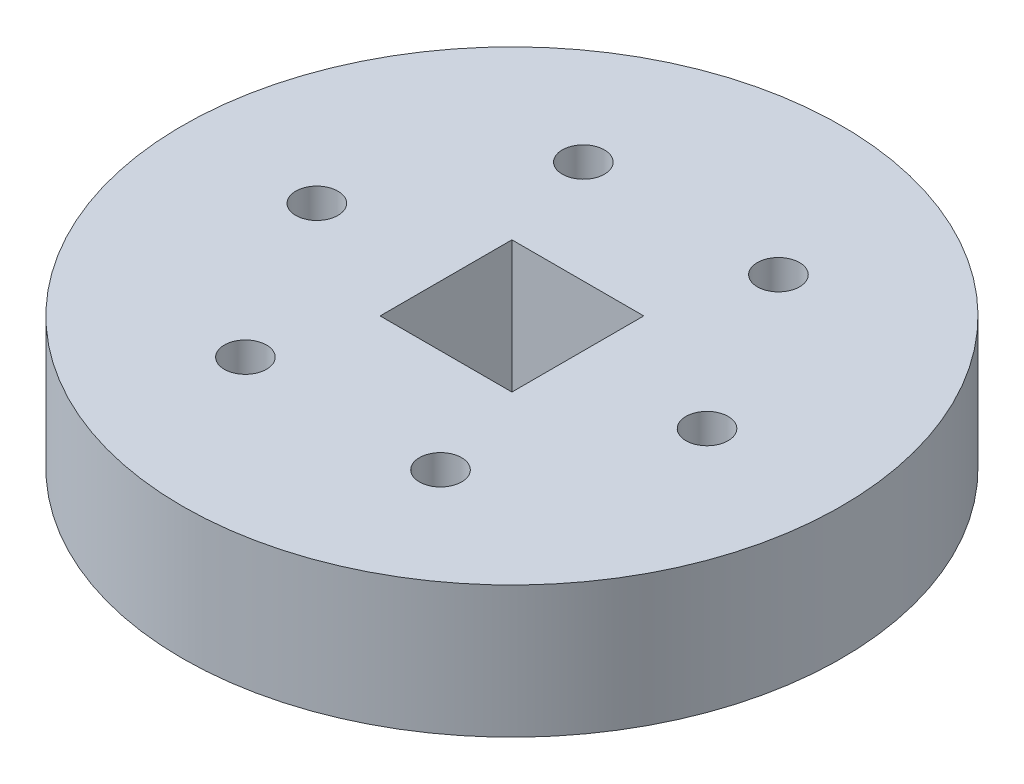
ISO-10303-21;
HEADER;
FILE_DESCRIPTION(('STEP AP214'),'2;1');
FILE_NAME('part.step','',(''),(''),'','','');
FILE_SCHEMA(('AUTOMOTIVE_DESIGN { 1 0 10303 214 1 1 1 1 }'));
ENDSEC;
DATA;
#1=APPLICATION_CONTEXT('core data for automotive mechanical design processes');
#2=APPLICATION_PROTOCOL_DEFINITION('international standard','automotive_design',2000,#1);
#3=PRODUCT_CONTEXT('',#1,'mechanical');
#4=PRODUCT('Part','Part','',(#3));
#5=PRODUCT_RELATED_PRODUCT_CATEGORY('part','',(#4));
#6=PRODUCT_DEFINITION_FORMATION('','',#4);
#7=PRODUCT_DEFINITION_CONTEXT('part definition',#1,'design');
#8=PRODUCT_DEFINITION('design','',#6,#7);
#9=PRODUCT_DEFINITION_SHAPE('','',#8);
#10=(LENGTH_UNIT() NAMED_UNIT(*) SI_UNIT(.MILLI.,.METRE.));
#11=(NAMED_UNIT(*) PLANE_ANGLE_UNIT() SI_UNIT($,.RADIAN.));
#12=(NAMED_UNIT(*) SI_UNIT($,.STERADIAN.) SOLID_ANGLE_UNIT());
#13=UNCERTAINTY_MEASURE_WITH_UNIT(LENGTH_MEASURE(1.E-05),#10,'distance_accuracy_value','');
#14=(GEOMETRIC_REPRESENTATION_CONTEXT(3) GLOBAL_UNCERTAINTY_ASSIGNED_CONTEXT((#13)) GLOBAL_UNIT_ASSIGNED_CONTEXT((#10,
#11,#12)) REPRESENTATION_CONTEXT('',''));
#15=CARTESIAN_POINT('',(0.,0.,0.));
#16=DIRECTION('',(0.,0.,1.));
#17=DIRECTION('',(1.,0.,0.));
#18=AXIS2_PLACEMENT_3D('',#15,#16,#17);
#19=CARTESIAN_POINT('',(0.,6.35,0.));
#20=DIRECTION('',(0.,1.,0.));
#21=DIRECTION('',(0.,0.,1.));
#22=AXIS2_PLACEMENT_3D('',#19,#20,#21);
#23=PLANE('',#22);
#24=CARTESIAN_POINT('',(-4.699,6.35,-8.13890674476615));
#25=DIRECTION('',(0.,1.,0.));
#26=DIRECTION('',(0.,0.,1.));
#27=AXIS2_PLACEMENT_3D('',#24,#25,#26);
#28=CIRCLE('',#27,1.016);
#29=CARTESIAN_POINT('',(-4.699,6.35,-7.12290674476615));
#30=VERTEX_POINT('',#29);
#31=EDGE_CURVE('E226',#30,#30,#28,.T.);
#32=ORIENTED_EDGE('',*,*,#31,.F.);
#33=EDGE_LOOP('',(#32));
#34=FACE_BOUND('',#33,.T.);
#35=CARTESIAN_POINT('',(-4.699,6.35,8.13890674476616));
#36=DIRECTION('',(0.,1.,0.));
#37=DIRECTION('',(0.,0.,1.));
#38=AXIS2_PLACEMENT_3D('',#35,#36,#37);
#39=CIRCLE('',#38,1.016);
#40=CARTESIAN_POINT('',(-4.699,6.35,9.15490674476615));
#41=VERTEX_POINT('',#40);
#42=EDGE_CURVE('E238',#41,#41,#39,.T.);
#43=ORIENTED_EDGE('',*,*,#42,.F.);
#44=EDGE_LOOP('',(#43));
#45=FACE_BOUND('',#44,.T.);
#46=CARTESIAN_POINT('',(9.398,6.35,0.));
#47=DIRECTION('',(0.,1.,0.));
#48=DIRECTION('',(0.,0.,1.));
#49=AXIS2_PLACEMENT_3D('',#46,#47,#48);
#50=CIRCLE('',#49,1.016);
#51=CARTESIAN_POINT('',(9.398,6.35,1.016));
#52=VERTEX_POINT('',#51);
#53=EDGE_CURVE('E102',#52,#52,#50,.T.);
#54=ORIENTED_EDGE('',*,*,#53,.F.);
#55=EDGE_LOOP('',(#54));
#56=FACE_BOUND('',#55,.T.);
#57=CARTESIAN_POINT('',(0.,6.35,0.));
#58=DIRECTION('',(0.,1.,0.));
#59=DIRECTION('',(0.,0.,1.));
#60=AXIS2_PLACEMENT_3D('',#57,#58,#59);
#61=CIRCLE('',#60,15.875);
#62=CARTESIAN_POINT('',(0.,6.35,15.875));
#63=VERTEX_POINT('',#62);
#64=EDGE_CURVE('E11',#63,#63,#61,.T.);
#65=ORIENTED_EDGE('',*,*,#64,.T.);
#66=EDGE_LOOP('',(#65));
#67=FACE_BOUND('',#66,.T.);
#68=DIRECTION('',(-1.,0.,0.));
#69=VECTOR('',#68,1.);
#70=CARTESIAN_POINT('',(-3.175,6.35,-3.175));
#71=LINE('',#70,#69);
#72=CARTESIAN_POINT('',(3.175,6.35,-3.175));
#73=VERTEX_POINT('',#72);
#74=CARTESIAN_POINT('',(-3.175,6.35,-3.175));
#75=VERTEX_POINT('',#74);
#76=EDGE_CURVE('E82',#73,#75,#71,.T.);
#77=ORIENTED_EDGE('',*,*,#76,.F.);
#78=DIRECTION('',(0.,0.,-1.));
#79=VECTOR('',#78,1.);
#80=CARTESIAN_POINT('',(3.175,6.35,-3.175));
#81=LINE('',#80,#79);
#82=CARTESIAN_POINT('',(3.175,6.35,3.175));
#83=VERTEX_POINT('',#82);
#84=EDGE_CURVE('E74',#83,#73,#81,.T.);
#85=ORIENTED_EDGE('',*,*,#84,.F.);
#86=DIRECTION('',(1.,0.,0.));
#87=VECTOR('',#86,1.);
#88=CARTESIAN_POINT('',(-3.175,6.35,3.175));
#89=LINE('',#88,#87);
#90=CARTESIAN_POINT('',(-3.175,6.35,3.175));
#91=VERTEX_POINT('',#90);
#92=EDGE_CURVE('E96',#91,#83,#89,.T.);
#93=ORIENTED_EDGE('',*,*,#92,.F.);
#94=DIRECTION('',(0.,0.,1.));
#95=VECTOR('',#94,1.);
#96=CARTESIAN_POINT('',(-3.175,6.35,-3.175));
#97=LINE('',#96,#95);
#98=EDGE_CURVE('E94',#75,#91,#97,.T.);
#99=ORIENTED_EDGE('',*,*,#98,.F.);
#100=EDGE_LOOP('',(#77,#85,#93,#99));
#101=FACE_BOUND('',#100,.T.);
#102=CARTESIAN_POINT('',(4.699,6.35,8.13890674476615));
#103=DIRECTION('',(0.,1.,0.));
#104=DIRECTION('',(0.,0.,1.));
#105=AXIS2_PLACEMENT_3D('',#102,#103,#104);
#106=CIRCLE('',#105,1.016);
#107=CARTESIAN_POINT('',(4.699,6.35,9.15490674476615));
#108=VERTEX_POINT('',#107);
#109=EDGE_CURVE('E244',#108,#108,#106,.T.);
#110=ORIENTED_EDGE('',*,*,#109,.F.);
#111=EDGE_LOOP('',(#110));
#112=FACE_BOUND('',#111,.T.);
#113=CARTESIAN_POINT('',(-9.398,6.35,0.));
#114=DIRECTION('',(0.,1.,0.));
#115=DIRECTION('',(0.,0.,1.));
#116=AXIS2_PLACEMENT_3D('',#113,#114,#115);
#117=CIRCLE('',#116,1.016);
#118=CARTESIAN_POINT('',(-9.398,6.35,1.016));
#119=VERTEX_POINT('',#118);
#120=EDGE_CURVE('E232',#119,#119,#117,.T.);
#121=ORIENTED_EDGE('',*,*,#120,.F.);
#122=EDGE_LOOP('',(#121));
#123=FACE_BOUND('',#122,.T.);
#124=CARTESIAN_POINT('',(4.69899999999999,6.35,-8.13890674476616));
#125=DIRECTION('',(0.,1.,0.));
#126=DIRECTION('',(0.,0.,1.));
#127=AXIS2_PLACEMENT_3D('',#124,#125,#126);
#128=CIRCLE('',#127,1.016);
#129=CARTESIAN_POINT('',(4.69899999999999,6.35,-7.12290674476616));
#130=VERTEX_POINT('',#129);
#131=EDGE_CURVE('E217',#130,#130,#128,.T.);
#132=ORIENTED_EDGE('',*,*,#131,.F.);
#133=EDGE_LOOP('',(#132));
#134=FACE_BOUND('',#133,.T.);
#135=ADVANCED_FACE('F33',(#34,#45,#56,#67,#101,#112,#123,#134),#23,.T.);
#136=CARTESIAN_POINT('',(0.,0.,0.));
#137=DIRECTION('',(0.,1.,0.));
#138=DIRECTION('',(0.,0.,1.));
#139=AXIS2_PLACEMENT_3D('',#136,#137,#138);
#140=PLANE('',#139);
#141=CARTESIAN_POINT('',(-4.699,0.,-8.13890674476615));
#142=DIRECTION('',(0.,1.,0.));
#143=DIRECTION('',(0.,0.,1.));
#144=AXIS2_PLACEMENT_3D('',#141,#142,#143);
#145=CIRCLE('',#144,1.016);
#146=CARTESIAN_POINT('',(-4.699,0.,-7.12290674476615));
#147=VERTEX_POINT('',#146);
#148=EDGE_CURVE('E223',#147,#147,#145,.T.);
#149=ORIENTED_EDGE('',*,*,#148,.T.);
#150=EDGE_LOOP('',(#149));
#151=FACE_BOUND('',#150,.T.);
#152=CARTESIAN_POINT('',(-4.699,0.,8.13890674476616));
#153=DIRECTION('',(0.,1.,0.));
#154=DIRECTION('',(0.,0.,1.));
#155=AXIS2_PLACEMENT_3D('',#152,#153,#154);
#156=CIRCLE('',#155,1.016);
#157=CARTESIAN_POINT('',(-4.699,0.,9.15490674476615));
#158=VERTEX_POINT('',#157);
#159=EDGE_CURVE('E235',#158,#158,#156,.T.);
#160=ORIENTED_EDGE('',*,*,#159,.T.);
#161=EDGE_LOOP('',(#160));
#162=FACE_BOUND('',#161,.T.);
#163=CARTESIAN_POINT('',(9.398,0.,0.));
#164=DIRECTION('',(0.,1.,0.));
#165=DIRECTION('',(0.,0.,1.));
#166=AXIS2_PLACEMENT_3D('',#163,#164,#165);
#167=CIRCLE('',#166,1.016);
#168=CARTESIAN_POINT('',(9.398,0.,1.016));
#169=VERTEX_POINT('',#168);
#170=EDGE_CURVE('E247',#169,#169,#167,.T.);
#171=ORIENTED_EDGE('',*,*,#170,.T.);
#172=EDGE_LOOP('',(#171));
#173=FACE_BOUND('',#172,.T.);
#174=CARTESIAN_POINT('',(0.,0.,0.));
#175=DIRECTION('',(0.,1.,0.));
#176=DIRECTION('',(0.,0.,1.));
#177=AXIS2_PLACEMENT_3D('',#174,#175,#176);
#178=CIRCLE('',#177,15.875);
#179=CARTESIAN_POINT('',(0.,0.,15.875));
#180=VERTEX_POINT('',#179);
#181=EDGE_CURVE('E37',#180,#180,#178,.T.);
#182=ORIENTED_EDGE('',*,*,#181,.F.);
#183=EDGE_LOOP('',(#182));
#184=FACE_BOUND('',#183,.T.);
#185=DIRECTION('',(0.,0.,-1.));
#186=VECTOR('',#185,1.);
#187=CARTESIAN_POINT('',(3.175,0.,-3.175));
#188=LINE('',#187,#186);
#189=CARTESIAN_POINT('',(3.175,0.,3.175));
#190=VERTEX_POINT('',#189);
#191=CARTESIAN_POINT('',(3.175,0.,-3.175));
#192=VERTEX_POINT('',#191);
#193=EDGE_CURVE('E56',#190,#192,#188,.T.);
#194=ORIENTED_EDGE('',*,*,#193,.T.);
#195=DIRECTION('',(-1.,0.,0.));
#196=VECTOR('',#195,1.);
#197=CARTESIAN_POINT('',(-3.175,0.,-3.175));
#198=LINE('',#197,#196);
#199=CARTESIAN_POINT('',(-3.175,0.,-3.175));
#200=VERTEX_POINT('',#199);
#201=EDGE_CURVE('E89',#192,#200,#198,.T.);
#202=ORIENTED_EDGE('',*,*,#201,.T.);
#203=DIRECTION('',(0.,0.,1.));
#204=VECTOR('',#203,1.);
#205=CARTESIAN_POINT('',(-3.175,0.,-3.175));
#206=LINE('',#205,#204);
#207=CARTESIAN_POINT('',(-3.175,0.,3.175));
#208=VERTEX_POINT('',#207);
#209=EDGE_CURVE('E104',#200,#208,#206,.T.);
#210=ORIENTED_EDGE('',*,*,#209,.T.);
#211=DIRECTION('',(1.,0.,0.));
#212=VECTOR('',#211,1.);
#213=CARTESIAN_POINT('',(-3.175,0.,3.175));
#214=LINE('',#213,#212);
#215=EDGE_CURVE('E83',#208,#190,#214,.T.);
#216=ORIENTED_EDGE('',*,*,#215,.T.);
#217=EDGE_LOOP('',(#194,#202,#210,#216));
#218=FACE_BOUND('',#217,.T.);
#219=CARTESIAN_POINT('',(4.699,0.,8.13890674476615));
#220=DIRECTION('',(0.,1.,0.));
#221=DIRECTION('',(0.,0.,1.));
#222=AXIS2_PLACEMENT_3D('',#219,#220,#221);
#223=CIRCLE('',#222,1.016);
#224=CARTESIAN_POINT('',(4.699,0.,9.15490674476615));
#225=VERTEX_POINT('',#224);
#226=EDGE_CURVE('E241',#225,#225,#223,.T.);
#227=ORIENTED_EDGE('',*,*,#226,.T.);
#228=EDGE_LOOP('',(#227));
#229=FACE_BOUND('',#228,.T.);
#230=CARTESIAN_POINT('',(-9.398,0.,0.));
#231=DIRECTION('',(0.,1.,0.));
#232=DIRECTION('',(0.,0.,1.));
#233=AXIS2_PLACEMENT_3D('',#230,#231,#232);
#234=CIRCLE('',#233,1.016);
#235=CARTESIAN_POINT('',(-9.398,0.,1.016));
#236=VERTEX_POINT('',#235);
#237=EDGE_CURVE('E229',#236,#236,#234,.T.);
#238=ORIENTED_EDGE('',*,*,#237,.T.);
#239=EDGE_LOOP('',(#238));
#240=FACE_BOUND('',#239,.T.);
#241=CARTESIAN_POINT('',(4.69899999999999,0.,-8.13890674476616));
#242=DIRECTION('',(0.,1.,0.));
#243=DIRECTION('',(0.,0.,1.));
#244=AXIS2_PLACEMENT_3D('',#241,#242,#243);
#245=CIRCLE('',#244,1.016);
#246=CARTESIAN_POINT('',(4.69899999999999,0.,-7.12290674476616));
#247=VERTEX_POINT('',#246);
#248=EDGE_CURVE('E220',#247,#247,#245,.T.);
#249=ORIENTED_EDGE('',*,*,#248,.T.);
#250=EDGE_LOOP('',(#249));
#251=FACE_BOUND('',#250,.T.);
#252=ADVANCED_FACE('F115',(#151,#162,#173,#184,#218,#229,#240,#251),#140,.F.);
#253=CARTESIAN_POINT('',(0.,6.35,0.));
#254=DIRECTION('',(0.,-1.,0.));
#255=DIRECTION('',(0.,0.,-1.));
#256=AXIS2_PLACEMENT_3D('',#253,#254,#255);
#257=CYLINDRICAL_SURFACE('',#256,15.875);
#258=ORIENTED_EDGE('',*,*,#64,.F.);
#259=EDGE_LOOP('',(#258));
#260=FACE_BOUND('',#259,.T.);
#261=ORIENTED_EDGE('',*,*,#181,.T.);
#262=EDGE_LOOP('',(#261));
#263=FACE_BOUND('',#262,.T.);
#264=ADVANCED_FACE('F35',(#260,#263),#257,.T.);
#265=CARTESIAN_POINT('',(3.175,6.35,-3.175));
#266=DIRECTION('',(-1.,0.,0.));
#267=DIRECTION('',(0.,0.,1.));
#268=AXIS2_PLACEMENT_3D('',#265,#266,#267);
#269=PLANE('',#268);
#270=ORIENTED_EDGE('',*,*,#193,.F.);
#271=DIRECTION('',(0.,-1.,0.));
#272=VECTOR('',#271,1.);
#273=CARTESIAN_POINT('',(3.175,6.35,3.175));
#274=LINE('',#273,#272);
#275=EDGE_CURVE('E78',#83,#190,#274,.T.);
#276=ORIENTED_EDGE('',*,*,#275,.F.);
#277=ORIENTED_EDGE('',*,*,#84,.T.);
#278=DIRECTION('',(0.,-1.,0.));
#279=VECTOR('',#278,1.);
#280=CARTESIAN_POINT('',(3.175,6.35,-3.175));
#281=LINE('',#280,#279);
#282=EDGE_CURVE('E77',#73,#192,#281,.T.);
#283=ORIENTED_EDGE('',*,*,#282,.T.);
#284=EDGE_LOOP('',(#270,#276,#277,#283));
#285=FACE_BOUND('',#284,.T.);
#286=ADVANCED_FACE('F76',(#285),#269,.T.);
#287=CARTESIAN_POINT('',(-3.175,6.35,-3.175));
#288=DIRECTION('',(0.,0.,1.));
#289=DIRECTION('',(1.,0.,0.));
#290=AXIS2_PLACEMENT_3D('',#287,#288,#289);
#291=PLANE('',#290);
#292=ORIENTED_EDGE('',*,*,#201,.F.);
#293=ORIENTED_EDGE('',*,*,#282,.F.);
#294=ORIENTED_EDGE('',*,*,#76,.T.);
#295=DIRECTION('',(0.,-1.,0.));
#296=VECTOR('',#295,1.);
#297=CARTESIAN_POINT('',(-3.175,6.35,-3.175));
#298=LINE('',#297,#296);
#299=EDGE_CURVE('E90',#75,#200,#298,.T.);
#300=ORIENTED_EDGE('',*,*,#299,.T.);
#301=EDGE_LOOP('',(#292,#293,#294,#300));
#302=FACE_BOUND('',#301,.T.);
#303=ADVANCED_FACE('F86',(#302),#291,.T.);
#304=CARTESIAN_POINT('',(-3.175,6.35,-3.175));
#305=DIRECTION('',(1.,0.,0.));
#306=DIRECTION('',(0.,0.,-1.));
#307=AXIS2_PLACEMENT_3D('',#304,#305,#306);
#308=PLANE('',#307);
#309=ORIENTED_EDGE('',*,*,#209,.F.);
#310=ORIENTED_EDGE('',*,*,#299,.F.);
#311=ORIENTED_EDGE('',*,*,#98,.T.);
#312=DIRECTION('',(0.,-1.,0.));
#313=VECTOR('',#312,1.);
#314=CARTESIAN_POINT('',(-3.175,6.35,3.175));
#315=LINE('',#314,#313);
#316=EDGE_CURVE('E48',#91,#208,#315,.T.);
#317=ORIENTED_EDGE('',*,*,#316,.T.);
#318=EDGE_LOOP('',(#309,#310,#311,#317));
#319=FACE_BOUND('',#318,.T.);
#320=ADVANCED_FACE('F113',(#319),#308,.T.);
#321=CARTESIAN_POINT('',(-3.175,6.35,3.175));
#322=DIRECTION('',(0.,0.,-1.));
#323=DIRECTION('',(-1.,0.,0.));
#324=AXIS2_PLACEMENT_3D('',#321,#322,#323);
#325=PLANE('',#324);
#326=ORIENTED_EDGE('',*,*,#215,.F.);
#327=ORIENTED_EDGE('',*,*,#316,.F.);
#328=ORIENTED_EDGE('',*,*,#92,.T.);
#329=ORIENTED_EDGE('',*,*,#275,.T.);
#330=EDGE_LOOP('',(#326,#327,#328,#329));
#331=FACE_BOUND('',#330,.T.);
#332=ADVANCED_FACE('F117',(#331),#325,.T.);
#333=CARTESIAN_POINT('',(9.398,6.35,0.));
#334=DIRECTION('',(0.,-1.,0.));
#335=DIRECTION('',(0.,0.,-1.));
#336=AXIS2_PLACEMENT_3D('',#333,#334,#335);
#337=CYLINDRICAL_SURFACE('',#336,1.016);
#338=ORIENTED_EDGE('',*,*,#53,.T.);
#339=EDGE_LOOP('',(#338));
#340=FACE_BOUND('',#339,.T.);
#341=ORIENTED_EDGE('',*,*,#170,.F.);
#342=EDGE_LOOP('',(#341));
#343=FACE_BOUND('',#342,.T.);
#344=ADVANCED_FACE('F119',(#340,#343),#337,.F.);
#345=CARTESIAN_POINT('',(4.699,6.35,8.13890674476615));
#346=DIRECTION('',(0.,-1.,0.));
#347=DIRECTION('',(0.,0.,-1.));
#348=AXIS2_PLACEMENT_3D('',#345,#346,#347);
#349=CYLINDRICAL_SURFACE('',#348,1.016);
#350=ORIENTED_EDGE('',*,*,#109,.T.);
#351=EDGE_LOOP('',(#350));
#352=FACE_BOUND('',#351,.T.);
#353=ORIENTED_EDGE('',*,*,#226,.F.);
#354=EDGE_LOOP('',(#353));
#355=FACE_BOUND('',#354,.T.);
#356=ADVANCED_FACE('F125',(#352,#355),#349,.F.);
#357=CARTESIAN_POINT('',(-4.699,6.35,8.13890674476616));
#358=DIRECTION('',(0.,-1.,0.));
#359=DIRECTION('',(0.,0.,-1.));
#360=AXIS2_PLACEMENT_3D('',#357,#358,#359);
#361=CYLINDRICAL_SURFACE('',#360,1.016);
#362=ORIENTED_EDGE('',*,*,#42,.T.);
#363=EDGE_LOOP('',(#362));
#364=FACE_BOUND('',#363,.T.);
#365=ORIENTED_EDGE('',*,*,#159,.F.);
#366=EDGE_LOOP('',(#365));
#367=FACE_BOUND('',#366,.T.);
#368=ADVANCED_FACE('F170',(#364,#367),#361,.F.);
#369=CARTESIAN_POINT('',(-9.398,6.35,0.));
#370=DIRECTION('',(0.,-1.,0.));
#371=DIRECTION('',(0.,0.,-1.));
#372=AXIS2_PLACEMENT_3D('',#369,#370,#371);
#373=CYLINDRICAL_SURFACE('',#372,1.016);
#374=ORIENTED_EDGE('',*,*,#120,.T.);
#375=EDGE_LOOP('',(#374));
#376=FACE_BOUND('',#375,.T.);
#377=ORIENTED_EDGE('',*,*,#237,.F.);
#378=EDGE_LOOP('',(#377));
#379=FACE_BOUND('',#378,.T.);
#380=ADVANCED_FACE('F180',(#376,#379),#373,.F.);
#381=CARTESIAN_POINT('',(-4.699,6.35,-8.13890674476615));
#382=DIRECTION('',(0.,-1.,0.));
#383=DIRECTION('',(0.,0.,-1.));
#384=AXIS2_PLACEMENT_3D('',#381,#382,#383);
#385=CYLINDRICAL_SURFACE('',#384,1.016);
#386=ORIENTED_EDGE('',*,*,#31,.T.);
#387=EDGE_LOOP('',(#386));
#388=FACE_BOUND('',#387,.T.);
#389=ORIENTED_EDGE('',*,*,#148,.F.);
#390=EDGE_LOOP('',(#389));
#391=FACE_BOUND('',#390,.T.);
#392=ADVANCED_FACE('F190',(#388,#391),#385,.F.);
#393=CARTESIAN_POINT('',(4.69899999999999,6.35,-8.13890674476616));
#394=DIRECTION('',(0.,-1.,0.));
#395=DIRECTION('',(0.,0.,-1.));
#396=AXIS2_PLACEMENT_3D('',#393,#394,#395);
#397=CYLINDRICAL_SURFACE('',#396,1.016);
#398=ORIENTED_EDGE('',*,*,#131,.T.);
#399=EDGE_LOOP('',(#398));
#400=FACE_BOUND('',#399,.T.);
#401=ORIENTED_EDGE('',*,*,#248,.F.);
#402=EDGE_LOOP('',(#401));
#403=FACE_BOUND('',#402,.T.);
#404=ADVANCED_FACE('F200',(#400,#403),#397,.F.);
#405=CLOSED_SHELL('',(#135,#252,#264,#286,#303,#320,#332,#344,#356,#368,#380,#392,#404));
#406=MANIFOLD_SOLID_BREP('B2',#405);
#407=ADVANCED_BREP_SHAPE_REPRESENTATION('',(#18,#406),#14);
#408=SHAPE_DEFINITION_REPRESENTATION(#9,#407);
ENDSEC;
END-ISO-10303-21;
